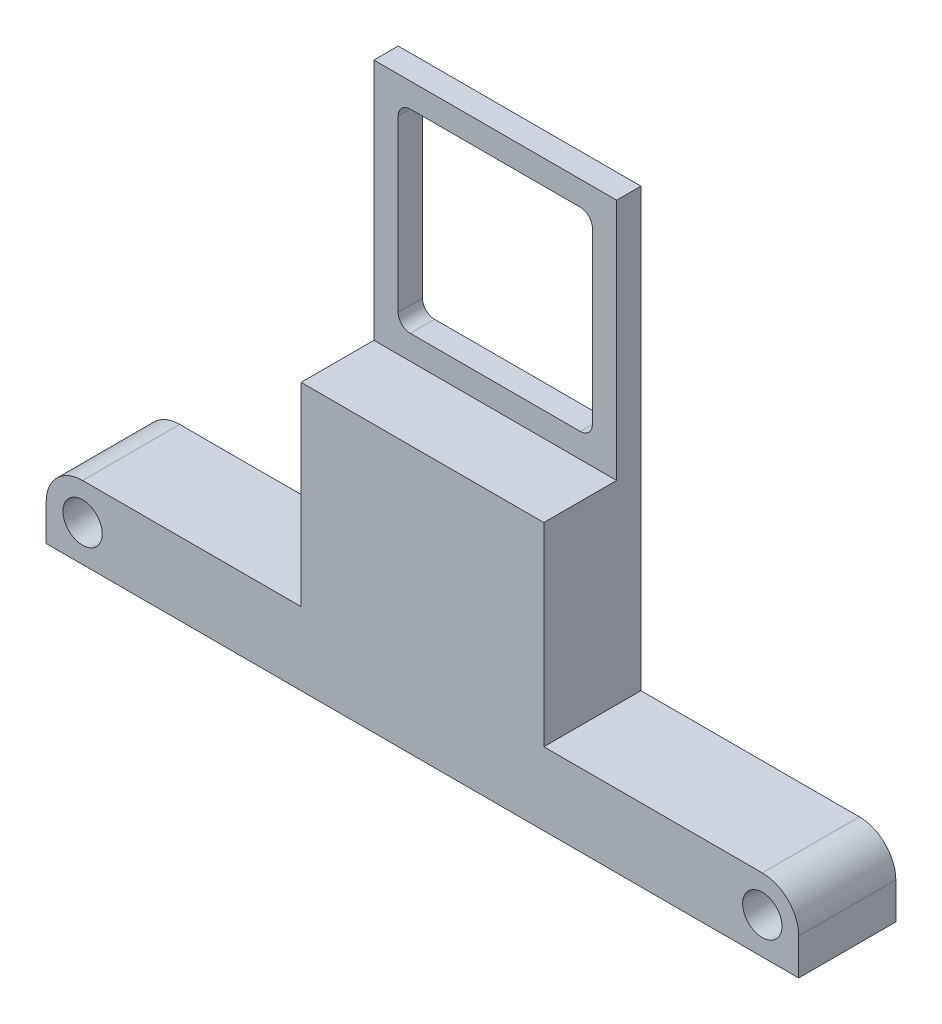
ISO-10303-21;
HEADER;
FILE_DESCRIPTION(('STEP AP214'),'2;1');
FILE_NAME('part.step','',(''),(''),'','','');
FILE_SCHEMA(('AUTOMOTIVE_DESIGN { 1 0 10303 214 1 1 1 1 }'));
ENDSEC;
DATA;
#1=APPLICATION_CONTEXT('core data for automotive mechanical design processes');
#2=APPLICATION_PROTOCOL_DEFINITION('international standard','automotive_design',2000,#1);
#3=PRODUCT_CONTEXT('',#1,'mechanical');
#4=PRODUCT('Part','Part','',(#3));
#5=PRODUCT_RELATED_PRODUCT_CATEGORY('part','',(#4));
#6=PRODUCT_DEFINITION_FORMATION('','',#4);
#7=PRODUCT_DEFINITION_CONTEXT('part definition',#1,'design');
#8=PRODUCT_DEFINITION('design','',#6,#7);
#9=PRODUCT_DEFINITION_SHAPE('','',#8);
#10=(LENGTH_UNIT() NAMED_UNIT(*) SI_UNIT(.MILLI.,.METRE.));
#11=(NAMED_UNIT(*) PLANE_ANGLE_UNIT() SI_UNIT($,.RADIAN.));
#12=(NAMED_UNIT(*) SI_UNIT($,.STERADIAN.) SOLID_ANGLE_UNIT());
#13=UNCERTAINTY_MEASURE_WITH_UNIT(LENGTH_MEASURE(1.E-05),#10,'distance_accuracy_value','');
#14=(GEOMETRIC_REPRESENTATION_CONTEXT(3) GLOBAL_UNCERTAINTY_ASSIGNED_CONTEXT((#13)) GLOBAL_UNIT_ASSIGNED_CONTEXT((#10,
#11,#12)) REPRESENTATION_CONTEXT('',''));
#15=CARTESIAN_POINT('',(0.,0.,0.));
#16=DIRECTION('',(0.,0.,1.));
#17=DIRECTION('',(1.,0.,0.));
#18=AXIS2_PLACEMENT_3D('',#15,#16,#17);
#19=CARTESIAN_POINT('',(-25.,105.,10.));
#20=DIRECTION('',(0.,-1.,0.));
#21=DIRECTION('',(0.,0.,-1.));
#22=AXIS2_PLACEMENT_3D('',#19,#20,#21);
#23=PLANE('',#22);
#24=DIRECTION('',(-1.,0.,0.));
#25=VECTOR('',#24,1.);
#26=CARTESIAN_POINT('',(-25.,105.,-5.));
#27=LINE('',#26,#25);
#28=CARTESIAN_POINT('',(25.,105.,-5.));
#29=VERTEX_POINT('',#28);
#30=CARTESIAN_POINT('',(-25.,105.,-5.));
#31=VERTEX_POINT('',#30);
#32=EDGE_CURVE('E194',#29,#31,#27,.T.);
#33=ORIENTED_EDGE('',*,*,#32,.F.);
#34=DIRECTION('',(0.,0.,-1.));
#35=VECTOR('',#34,1.);
#36=CARTESIAN_POINT('',(25.,105.,10.));
#37=LINE('',#36,#35);
#38=CARTESIAN_POINT('',(25.,105.,-10.));
#39=VERTEX_POINT('',#38);
#40=EDGE_CURVE('E304',#29,#39,#37,.T.);
#41=ORIENTED_EDGE('',*,*,#40,.T.);
#42=DIRECTION('',(-1.,0.,0.));
#43=VECTOR('',#42,1.);
#44=CARTESIAN_POINT('',(-25.,105.,-10.));
#45=LINE('',#44,#43);
#46=CARTESIAN_POINT('',(-25.,105.,-10.));
#47=VERTEX_POINT('',#46);
#48=EDGE_CURVE('E278',#39,#47,#45,.T.);
#49=ORIENTED_EDGE('',*,*,#48,.T.);
#50=DIRECTION('',(0.,0.,-1.));
#51=VECTOR('',#50,1.);
#52=CARTESIAN_POINT('',(-25.,105.,10.));
#53=LINE('',#52,#51);
#54=EDGE_CURVE('E301',#31,#47,#53,.T.);
#55=ORIENTED_EDGE('',*,*,#54,.F.);
#56=EDGE_LOOP('',(#33,#41,#49,#55));
#57=FACE_BOUND('',#56,.T.);
#58=ADVANCED_FACE('F39',(#57),#23,.F.);
#59=CARTESIAN_POINT('',(-70.,7.5,10.));
#60=DIRECTION('',(0.,0.,-1.));
#61=DIRECTION('',(-1.,0.,0.));
#62=AXIS2_PLACEMENT_3D('',#59,#60,#61);
#63=PLANE('',#62);
#64=DIRECTION('',(0.,1.,0.));
#65=VECTOR('',#64,1.);
#66=CARTESIAN_POINT('',(25.,105.,10.));
#67=LINE('',#66,#65);
#68=CARTESIAN_POINT('',(25.,15.,10.));
#69=VERTEX_POINT('',#68);
#70=CARTESIAN_POINT('',(25.,55.,10.));
#71=VERTEX_POINT('',#70);
#72=EDGE_CURVE('E246',#69,#71,#67,.T.);
#73=ORIENTED_EDGE('',*,*,#72,.T.);
#74=DIRECTION('',(1.,0.,0.));
#75=VECTOR('',#74,1.);
#76=CARTESIAN_POINT('',(-25.,55.,10.));
#77=LINE('',#76,#75);
#78=CARTESIAN_POINT('',(-25.,55.,10.));
#79=VERTEX_POINT('',#78);
#80=EDGE_CURVE('E198',#79,#71,#77,.T.);
#81=ORIENTED_EDGE('',*,*,#80,.F.);
#82=DIRECTION('',(0.,-1.,0.));
#83=VECTOR('',#82,1.);
#84=CARTESIAN_POINT('',(-25.,15.,10.));
#85=LINE('',#84,#83);
#86=CARTESIAN_POINT('',(-25.,15.,10.));
#87=VERTEX_POINT('',#86);
#88=EDGE_CURVE('E203',#79,#87,#85,.T.);
#89=ORIENTED_EDGE('',*,*,#88,.T.);
#90=DIRECTION('',(-1.,0.,0.));
#91=VECTOR('',#90,1.);
#92=CARTESIAN_POINT('',(-70.,15.,10.));
#93=LINE('',#92,#91);
#94=CARTESIAN_POINT('',(-70.,15.,10.));
#95=VERTEX_POINT('',#94);
#96=EDGE_CURVE('E252',#87,#95,#93,.T.);
#97=ORIENTED_EDGE('',*,*,#96,.T.);
#98=CARTESIAN_POINT('',(-70.,7.5,10.));
#99=DIRECTION('',(0.,0.,1.));
#100=DIRECTION('',(-1.,0.,0.));
#101=AXIS2_PLACEMENT_3D('',#98,#99,#100);
#102=CIRCLE('',#101,7.5);
#103=CARTESIAN_POINT('',(-77.5,7.5,10.));
#104=VERTEX_POINT('',#103);
#105=EDGE_CURVE('E255',#95,#104,#102,.T.);
#106=ORIENTED_EDGE('',*,*,#105,.T.);
#107=DIRECTION('',(0.,-1.,0.));
#108=VECTOR('',#107,1.);
#109=CARTESIAN_POINT('',(-77.5,0.,10.));
#110=LINE('',#109,#108);
#111=CARTESIAN_POINT('',(-77.5,0.,10.));
#112=VERTEX_POINT('',#111);
#113=EDGE_CURVE('E229',#104,#112,#110,.T.);
#114=ORIENTED_EDGE('',*,*,#113,.T.);
#115=DIRECTION('',(1.,0.,0.));
#116=VECTOR('',#115,1.);
#117=CARTESIAN_POINT('',(-77.5,0.,10.));
#118=LINE('',#117,#116);
#119=CARTESIAN_POINT('',(77.5,0.,10.));
#120=VERTEX_POINT('',#119);
#121=EDGE_CURVE('E233',#112,#120,#118,.T.);
#122=ORIENTED_EDGE('',*,*,#121,.T.);
#123=DIRECTION('',(0.,1.,0.));
#124=VECTOR('',#123,1.);
#125=CARTESIAN_POINT('',(77.5,7.50000000000003,10.));
#126=LINE('',#125,#124);
#127=CARTESIAN_POINT('',(77.5,7.50000000000003,10.));
#128=VERTEX_POINT('',#127);
#129=EDGE_CURVE('E237',#120,#128,#126,.T.);
#130=ORIENTED_EDGE('',*,*,#129,.T.);
#131=CARTESIAN_POINT('',(70.,7.5,10.));
#132=DIRECTION('',(0.,0.,1.));
#133=DIRECTION('',(-1.,0.,0.));
#134=AXIS2_PLACEMENT_3D('',#131,#132,#133);
#135=CIRCLE('',#134,7.50000000000001);
#136=CARTESIAN_POINT('',(70.,15.,10.));
#137=VERTEX_POINT('',#136);
#138=EDGE_CURVE('E240',#128,#137,#135,.T.);
#139=ORIENTED_EDGE('',*,*,#138,.T.);
#140=DIRECTION('',(-1.,0.,0.));
#141=VECTOR('',#140,1.);
#142=CARTESIAN_POINT('',(25.,15.,10.));
#143=LINE('',#142,#141);
#144=EDGE_CURVE('E243',#137,#69,#143,.T.);
#145=ORIENTED_EDGE('',*,*,#144,.T.);
#146=EDGE_LOOP('',(#73,#81,#89,#97,#106,#114,#122,#130,#139,#145));
#147=FACE_BOUND('',#146,.T.);
#148=CARTESIAN_POINT('',(-70.,7.5,10.));
#149=DIRECTION('',(0.,0.,1.));
#150=DIRECTION('',(1.,0.,0.));
#151=AXIS2_PLACEMENT_3D('',#148,#149,#150);
#152=CIRCLE('',#151,4.05);
#153=CARTESIAN_POINT('',(-65.95,7.5,10.));
#154=VERTEX_POINT('',#153);
#155=EDGE_CURVE('E221',#154,#154,#152,.T.);
#156=ORIENTED_EDGE('',*,*,#155,.F.);
#157=EDGE_LOOP('',(#156));
#158=FACE_BOUND('',#157,.T.);
#159=CARTESIAN_POINT('',(70.,7.5,10.));
#160=DIRECTION('',(0.,0.,1.));
#161=DIRECTION('',(1.,0.,0.));
#162=AXIS2_PLACEMENT_3D('',#159,#160,#161);
#163=CIRCLE('',#162,4.05);
#164=CARTESIAN_POINT('',(74.05,7.5,10.));
#165=VERTEX_POINT('',#164);
#166=EDGE_CURVE('E213',#165,#165,#163,.T.);
#167=ORIENTED_EDGE('',*,*,#166,.F.);
#168=EDGE_LOOP('',(#167));
#169=FACE_BOUND('',#168,.T.);
#170=ADVANCED_FACE('F423',(#147,#158,#169),#63,.F.);
#171=CARTESIAN_POINT('',(-70.,7.5,-10.));
#172=DIRECTION('',(0.,0.,-1.));
#173=DIRECTION('',(-1.,0.,0.));
#174=AXIS2_PLACEMENT_3D('',#171,#172,#173);
#175=PLANE('',#174);
#176=DIRECTION('',(-1.,0.,0.));
#177=VECTOR('',#176,1.);
#178=CARTESIAN_POINT('',(-20.,100.,-10.));
#179=LINE('',#178,#177);
#180=CARTESIAN_POINT('',(17.5,100.,-10.));
#181=VERTEX_POINT('',#180);
#182=CARTESIAN_POINT('',(-17.5,100.,-10.));
#183=VERTEX_POINT('',#182);
#184=EDGE_CURVE('E400',#181,#183,#179,.T.);
#185=ORIENTED_EDGE('',*,*,#184,.T.);
#186=CARTESIAN_POINT('',(-17.5,97.5,-10.));
#187=DIRECTION('',(0.,0.,-1.));
#188=DIRECTION('',(-1.,0.,0.));
#189=AXIS2_PLACEMENT_3D('',#186,#187,#188);
#190=CIRCLE('',#189,2.5);
#191=CARTESIAN_POINT('',(-20.,97.5,-10.));
#192=VERTEX_POINT('',#191);
#193=EDGE_CURVE('E62',#183,#192,#190,.F.);
#194=ORIENTED_EDGE('',*,*,#193,.T.);
#195=DIRECTION('',(0.,-1.,0.));
#196=VECTOR('',#195,1.);
#197=CARTESIAN_POINT('',(-20.,100.,-10.));
#198=LINE('',#197,#196);
#199=CARTESIAN_POINT('',(-20.,62.5,-10.));
#200=VERTEX_POINT('',#199);
#201=EDGE_CURVE('E390',#192,#200,#198,.T.);
#202=ORIENTED_EDGE('',*,*,#201,.T.);
#203=CARTESIAN_POINT('',(-17.5,62.5,-10.));
#204=DIRECTION('',(0.,0.,-1.));
#205=DIRECTION('',(-1.,0.,0.));
#206=AXIS2_PLACEMENT_3D('',#203,#204,#205);
#207=CIRCLE('',#206,2.5);
#208=CARTESIAN_POINT('',(-17.5,60.,-10.));
#209=VERTEX_POINT('',#208);
#210=EDGE_CURVE('E11',#200,#209,#207,.F.);
#211=ORIENTED_EDGE('',*,*,#210,.T.);
#212=DIRECTION('',(1.,0.,0.));
#213=VECTOR('',#212,1.);
#214=CARTESIAN_POINT('',(-20.,60.,-10.));
#215=LINE('',#214,#213);
#216=CARTESIAN_POINT('',(17.5,60.,-10.));
#217=VERTEX_POINT('',#216);
#218=EDGE_CURVE('E388',#209,#217,#215,.T.);
#219=ORIENTED_EDGE('',*,*,#218,.T.);
#220=CARTESIAN_POINT('',(17.5,62.5,-10.));
#221=DIRECTION('',(0.,0.,-1.));
#222=DIRECTION('',(-1.,0.,0.));
#223=AXIS2_PLACEMENT_3D('',#220,#221,#222);
#224=CIRCLE('',#223,2.5);
#225=CARTESIAN_POINT('',(20.,62.5,-10.));
#226=VERTEX_POINT('',#225);
#227=EDGE_CURVE('E363',#217,#226,#224,.F.);
#228=ORIENTED_EDGE('',*,*,#227,.T.);
#229=DIRECTION('',(0.,1.,0.));
#230=VECTOR('',#229,1.);
#231=CARTESIAN_POINT('',(20.,100.,-10.));
#232=LINE('',#231,#230);
#233=CARTESIAN_POINT('',(20.,97.5,-10.));
#234=VERTEX_POINT('',#233);
#235=EDGE_CURVE('E395',#226,#234,#232,.T.);
#236=ORIENTED_EDGE('',*,*,#235,.T.);
#237=CARTESIAN_POINT('',(17.5,97.5,-10.));
#238=DIRECTION('',(0.,0.,-1.));
#239=DIRECTION('',(-1.,0.,0.));
#240=AXIS2_PLACEMENT_3D('',#237,#238,#239);
#241=CIRCLE('',#240,2.5);
#242=EDGE_CURVE('E357',#234,#181,#241,.F.);
#243=ORIENTED_EDGE('',*,*,#242,.T.);
#244=EDGE_LOOP('',(#185,#194,#202,#211,#219,#228,#236,#243));
#245=FACE_BOUND('',#244,.T.);
#246=CARTESIAN_POINT('',(-70.,7.5,-10.));
#247=DIRECTION('',(0.,0.,1.));
#248=DIRECTION('',(1.,0.,0.));
#249=AXIS2_PLACEMENT_3D('',#246,#247,#248);
#250=CIRCLE('',#249,4.05);
#251=CARTESIAN_POINT('',(-65.95,7.5,-10.));
#252=VERTEX_POINT('',#251);
#253=EDGE_CURVE('E217',#252,#252,#250,.T.);
#254=ORIENTED_EDGE('',*,*,#253,.T.);
#255=EDGE_LOOP('',(#254));
#256=FACE_BOUND('',#255,.T.);
#257=DIRECTION('',(0.,-1.,0.));
#258=VECTOR('',#257,1.);
#259=CARTESIAN_POINT('',(-77.5,0.,-10.));
#260=LINE('',#259,#258);
#261=CARTESIAN_POINT('',(-77.5,7.5,-10.));
#262=VERTEX_POINT('',#261);
#263=CARTESIAN_POINT('',(-77.5,0.,-10.));
#264=VERTEX_POINT('',#263);
#265=EDGE_CURVE('E225',#262,#264,#260,.T.);
#266=ORIENTED_EDGE('',*,*,#265,.F.);
#267=CARTESIAN_POINT('',(-70.,7.5,-10.));
#268=DIRECTION('',(0.,0.,1.));
#269=DIRECTION('',(-1.,0.,0.));
#270=AXIS2_PLACEMENT_3D('',#267,#268,#269);
#271=CIRCLE('',#270,7.5);
#272=CARTESIAN_POINT('',(-70.,15.,-10.));
#273=VERTEX_POINT('',#272);
#274=EDGE_CURVE('E234',#273,#262,#271,.T.);
#275=ORIENTED_EDGE('',*,*,#274,.F.);
#276=DIRECTION('',(-1.,0.,0.));
#277=VECTOR('',#276,1.);
#278=CARTESIAN_POINT('',(-70.,15.,-10.));
#279=LINE('',#278,#277);
#280=CARTESIAN_POINT('',(-25.,15.,-10.));
#281=VERTEX_POINT('',#280);
#282=EDGE_CURVE('E285',#281,#273,#279,.T.);
#283=ORIENTED_EDGE('',*,*,#282,.F.);
#284=DIRECTION('',(0.,-1.,0.));
#285=VECTOR('',#284,1.);
#286=CARTESIAN_POINT('',(-25.,15.,-10.));
#287=LINE('',#286,#285);
#288=EDGE_CURVE('E282',#47,#281,#287,.T.);
#289=ORIENTED_EDGE('',*,*,#288,.F.);
#290=ORIENTED_EDGE('',*,*,#48,.F.);
#291=DIRECTION('',(0.,1.,0.));
#292=VECTOR('',#291,1.);
#293=CARTESIAN_POINT('',(25.,105.,-10.));
#294=LINE('',#293,#292);
#295=CARTESIAN_POINT('',(25.,15.,-10.));
#296=VERTEX_POINT('',#295);
#297=EDGE_CURVE('E274',#296,#39,#294,.T.);
#298=ORIENTED_EDGE('',*,*,#297,.F.);
#299=DIRECTION('',(-1.,0.,0.));
#300=VECTOR('',#299,1.);
#301=CARTESIAN_POINT('',(25.,15.,-10.));
#302=LINE('',#301,#300);
#303=CARTESIAN_POINT('',(70.,15.,-10.));
#304=VERTEX_POINT('',#303);
#305=EDGE_CURVE('E271',#304,#296,#302,.T.);
#306=ORIENTED_EDGE('',*,*,#305,.F.);
#307=CARTESIAN_POINT('',(70.,7.5,-10.));
#308=DIRECTION('',(0.,0.,1.));
#309=DIRECTION('',(-1.,0.,0.));
#310=AXIS2_PLACEMENT_3D('',#307,#308,#309);
#311=CIRCLE('',#310,7.50000000000001);
#312=CARTESIAN_POINT('',(77.5,7.50000000000003,-10.));
#313=VERTEX_POINT('',#312);
#314=EDGE_CURVE('E268',#313,#304,#311,.T.);
#315=ORIENTED_EDGE('',*,*,#314,.F.);
#316=DIRECTION('',(0.,1.,0.));
#317=VECTOR('',#316,1.);
#318=CARTESIAN_POINT('',(77.5,7.50000000000003,-10.));
#319=LINE('',#318,#317);
#320=CARTESIAN_POINT('',(77.5,0.,-10.));
#321=VERTEX_POINT('',#320);
#322=EDGE_CURVE('E265',#321,#313,#319,.T.);
#323=ORIENTED_EDGE('',*,*,#322,.F.);
#324=DIRECTION('',(1.,0.,0.));
#325=VECTOR('',#324,1.);
#326=CARTESIAN_POINT('',(-77.5,0.,-10.));
#327=LINE('',#326,#325);
#328=EDGE_CURVE('E262',#264,#321,#327,.T.);
#329=ORIENTED_EDGE('',*,*,#328,.F.);
#330=EDGE_LOOP('',(#266,#275,#283,#289,#290,#298,#306,#315,#323,#329));
#331=FACE_BOUND('',#330,.T.);
#332=CARTESIAN_POINT('',(70.,7.5,-10.));
#333=DIRECTION('',(0.,0.,1.));
#334=DIRECTION('',(1.,0.,0.));
#335=AXIS2_PLACEMENT_3D('',#332,#333,#334);
#336=CIRCLE('',#335,4.05);
#337=CARTESIAN_POINT('',(74.05,7.5,-10.));
#338=VERTEX_POINT('',#337);
#339=EDGE_CURVE('E208',#338,#338,#336,.T.);
#340=ORIENTED_EDGE('',*,*,#339,.T.);
#341=EDGE_LOOP('',(#340));
#342=FACE_BOUND('',#341,.T.);
#343=ADVANCED_FACE('F386',(#245,#256,#331,#342),#175,.T.);
#344=CARTESIAN_POINT('',(-77.5,0.,10.));
#345=DIRECTION('',(1.,0.,0.));
#346=DIRECTION('',(0.,1.,0.));
#347=AXIS2_PLACEMENT_3D('',#344,#345,#346);
#348=PLANE('',#347);
#349=ORIENTED_EDGE('',*,*,#265,.T.);
#350=DIRECTION('',(0.,0.,-1.));
#351=VECTOR('',#350,1.);
#352=CARTESIAN_POINT('',(-77.5,0.,10.));
#353=LINE('',#352,#351);
#354=EDGE_CURVE('E323',#112,#264,#353,.T.);
#355=ORIENTED_EDGE('',*,*,#354,.F.);
#356=ORIENTED_EDGE('',*,*,#113,.F.);
#357=DIRECTION('',(0.,0.,-1.));
#358=VECTOR('',#357,1.);
#359=CARTESIAN_POINT('',(-77.5,7.5,10.));
#360=LINE('',#359,#358);
#361=EDGE_CURVE('E258',#104,#262,#360,.T.);
#362=ORIENTED_EDGE('',*,*,#361,.T.);
#363=EDGE_LOOP('',(#349,#355,#356,#362));
#364=FACE_BOUND('',#363,.T.);
#365=ADVANCED_FACE('F452',(#364),#348,.F.);
#366=CARTESIAN_POINT('',(-77.5,0.,10.));
#367=DIRECTION('',(0.,1.,0.));
#368=DIRECTION('',(-1.,0.,0.));
#369=AXIS2_PLACEMENT_3D('',#366,#367,#368);
#370=PLANE('',#369);
#371=ORIENTED_EDGE('',*,*,#328,.T.);
#372=DIRECTION('',(0.,0.,-1.));
#373=VECTOR('',#372,1.);
#374=CARTESIAN_POINT('',(77.5,0.,10.));
#375=LINE('',#374,#373);
#376=EDGE_CURVE('E319',#120,#321,#375,.T.);
#377=ORIENTED_EDGE('',*,*,#376,.F.);
#378=ORIENTED_EDGE('',*,*,#121,.F.);
#379=ORIENTED_EDGE('',*,*,#354,.T.);
#380=EDGE_LOOP('',(#371,#377,#378,#379));
#381=FACE_BOUND('',#380,.T.);
#382=ADVANCED_FACE('F458',(#381),#370,.F.);
#383=CARTESIAN_POINT('',(77.5,7.50000000000003,10.));
#384=DIRECTION('',(-1.,0.,0.));
#385=DIRECTION('',(0.,-1.,0.));
#386=AXIS2_PLACEMENT_3D('',#383,#384,#385);
#387=PLANE('',#386);
#388=ORIENTED_EDGE('',*,*,#322,.T.);
#389=DIRECTION('',(0.,0.,-1.));
#390=VECTOR('',#389,1.);
#391=CARTESIAN_POINT('',(77.5,7.50000000000003,10.));
#392=LINE('',#391,#390);
#393=EDGE_CURVE('E315',#128,#313,#392,.T.);
#394=ORIENTED_EDGE('',*,*,#393,.F.);
#395=ORIENTED_EDGE('',*,*,#129,.F.);
#396=ORIENTED_EDGE('',*,*,#376,.T.);
#397=EDGE_LOOP('',(#388,#394,#395,#396));
#398=FACE_BOUND('',#397,.T.);
#399=ADVANCED_FACE('F461',(#398),#387,.F.);
#400=CARTESIAN_POINT('',(70.,7.5,10.));
#401=DIRECTION('',(0.,0.,-1.));
#402=DIRECTION('',(-1.,0.,0.));
#403=AXIS2_PLACEMENT_3D('',#400,#401,#402);
#404=CYLINDRICAL_SURFACE('',#403,7.50000000000001);
#405=ORIENTED_EDGE('',*,*,#314,.T.);
#406=DIRECTION('',(0.,0.,-1.));
#407=VECTOR('',#406,1.);
#408=CARTESIAN_POINT('',(70.,15.,10.));
#409=LINE('',#408,#407);
#410=EDGE_CURVE('E311',#137,#304,#409,.T.);
#411=ORIENTED_EDGE('',*,*,#410,.F.);
#412=ORIENTED_EDGE('',*,*,#138,.F.);
#413=ORIENTED_EDGE('',*,*,#393,.T.);
#414=EDGE_LOOP('',(#405,#411,#412,#413));
#415=FACE_BOUND('',#414,.T.);
#416=ADVANCED_FACE('F463',(#415),#404,.T.);
#417=CARTESIAN_POINT('',(25.,15.,10.));
#418=DIRECTION('',(0.,-1.,0.));
#419=DIRECTION('',(1.,0.,0.));
#420=AXIS2_PLACEMENT_3D('',#417,#418,#419);
#421=PLANE('',#420);
#422=ORIENTED_EDGE('',*,*,#305,.T.);
#423=DIRECTION('',(0.,0.,-1.));
#424=VECTOR('',#423,1.);
#425=CARTESIAN_POINT('',(25.,15.,10.));
#426=LINE('',#425,#424);
#427=EDGE_CURVE('E307',#69,#296,#426,.T.);
#428=ORIENTED_EDGE('',*,*,#427,.F.);
#429=ORIENTED_EDGE('',*,*,#144,.F.);
#430=ORIENTED_EDGE('',*,*,#410,.T.);
#431=EDGE_LOOP('',(#422,#428,#429,#430));
#432=FACE_BOUND('',#431,.T.);
#433=ADVANCED_FACE('F430',(#432),#421,.F.);
#434=CARTESIAN_POINT('',(25.,105.,10.));
#435=DIRECTION('',(-1.,0.,0.));
#436=DIRECTION('',(0.,0.,1.));
#437=AXIS2_PLACEMENT_3D('',#434,#435,#436);
#438=PLANE('',#437);
#439=DIRECTION('',(0.,1.,0.));
#440=VECTOR('',#439,1.);
#441=CARTESIAN_POINT('',(25.,105.,-5.));
#442=LINE('',#441,#440);
#443=CARTESIAN_POINT('',(25.,55.,-5.));
#444=VERTEX_POINT('',#443);
#445=EDGE_CURVE('E188',#444,#29,#442,.T.);
#446=ORIENTED_EDGE('',*,*,#445,.F.);
#447=DIRECTION('',(0.,0.,1.));
#448=VECTOR('',#447,1.);
#449=CARTESIAN_POINT('',(25.,55.,-5.));
#450=LINE('',#449,#448);
#451=EDGE_CURVE('E184',#444,#71,#450,.T.);
#452=ORIENTED_EDGE('',*,*,#451,.T.);
#453=ORIENTED_EDGE('',*,*,#72,.F.);
#454=ORIENTED_EDGE('',*,*,#427,.T.);
#455=ORIENTED_EDGE('',*,*,#297,.T.);
#456=ORIENTED_EDGE('',*,*,#40,.F.);
#457=EDGE_LOOP('',(#446,#452,#453,#454,#455,#456));
#458=FACE_BOUND('',#457,.T.);
#459=ADVANCED_FACE('F421',(#458),#438,.F.);
#460=CARTESIAN_POINT('',(-25.,15.,10.));
#461=DIRECTION('',(1.,0.,0.));
#462=DIRECTION('',(0.,0.,-1.));
#463=AXIS2_PLACEMENT_3D('',#460,#461,#462);
#464=PLANE('',#463);
#465=ORIENTED_EDGE('',*,*,#88,.F.);
#466=DIRECTION('',(0.,0.,1.));
#467=VECTOR('',#466,1.);
#468=CARTESIAN_POINT('',(-25.,55.,-5.));
#469=LINE('',#468,#467);
#470=CARTESIAN_POINT('',(-25.,55.,-5.));
#471=VERTEX_POINT('',#470);
#472=EDGE_CURVE('E181',#471,#79,#469,.T.);
#473=ORIENTED_EDGE('',*,*,#472,.F.);
#474=DIRECTION('',(0.,-1.,0.));
#475=VECTOR('',#474,1.);
#476=CARTESIAN_POINT('',(-25.,105.,-5.));
#477=LINE('',#476,#475);
#478=EDGE_CURVE('E189',#31,#471,#477,.T.);
#479=ORIENTED_EDGE('',*,*,#478,.F.);
#480=ORIENTED_EDGE('',*,*,#54,.T.);
#481=ORIENTED_EDGE('',*,*,#288,.T.);
#482=DIRECTION('',(0.,0.,-1.));
#483=VECTOR('',#482,1.);
#484=CARTESIAN_POINT('',(-25.,15.,10.));
#485=LINE('',#484,#483);
#486=EDGE_CURVE('E297',#87,#281,#485,.T.);
#487=ORIENTED_EDGE('',*,*,#486,.F.);
#488=EDGE_LOOP('',(#465,#473,#479,#480,#481,#487));
#489=FACE_BOUND('',#488,.T.);
#490=ADVANCED_FACE('F201',(#489),#464,.F.);
#491=CARTESIAN_POINT('',(-70.,15.,10.));
#492=DIRECTION('',(0.,-1.,0.));
#493=DIRECTION('',(1.,0.,0.));
#494=AXIS2_PLACEMENT_3D('',#491,#492,#493);
#495=PLANE('',#494);
#496=ORIENTED_EDGE('',*,*,#282,.T.);
#497=DIRECTION('',(0.,0.,-1.));
#498=VECTOR('',#497,1.);
#499=CARTESIAN_POINT('',(-70.,15.,10.));
#500=LINE('',#499,#498);
#501=EDGE_CURVE('E293',#95,#273,#500,.T.);
#502=ORIENTED_EDGE('',*,*,#501,.F.);
#503=ORIENTED_EDGE('',*,*,#96,.F.);
#504=ORIENTED_EDGE('',*,*,#486,.T.);
#505=EDGE_LOOP('',(#496,#502,#503,#504));
#506=FACE_BOUND('',#505,.T.);
#507=ADVANCED_FACE('F443',(#506),#495,.F.);
#508=CARTESIAN_POINT('',(-70.,7.5,10.));
#509=DIRECTION('',(0.,0.,-1.));
#510=DIRECTION('',(-1.,0.,0.));
#511=AXIS2_PLACEMENT_3D('',#508,#509,#510);
#512=CYLINDRICAL_SURFACE('',#511,7.5);
#513=ORIENTED_EDGE('',*,*,#274,.T.);
#514=ORIENTED_EDGE('',*,*,#361,.F.);
#515=ORIENTED_EDGE('',*,*,#105,.F.);
#516=ORIENTED_EDGE('',*,*,#501,.T.);
#517=EDGE_LOOP('',(#513,#514,#515,#516));
#518=FACE_BOUND('',#517,.T.);
#519=ADVANCED_FACE('F448',(#518),#512,.T.);
#520=CARTESIAN_POINT('',(-70.,7.5,10.));
#521=DIRECTION('',(0.,0.,-1.));
#522=DIRECTION('',(-1.,0.,0.));
#523=AXIS2_PLACEMENT_3D('',#520,#521,#522);
#524=CYLINDRICAL_SURFACE('',#523,4.05);
#525=ORIENTED_EDGE('',*,*,#155,.T.);
#526=EDGE_LOOP('',(#525));
#527=FACE_BOUND('',#526,.T.);
#528=ORIENTED_EDGE('',*,*,#253,.F.);
#529=EDGE_LOOP('',(#528));
#530=FACE_BOUND('',#529,.T.);
#531=ADVANCED_FACE('F491',(#527,#530),#524,.F.);
#532=CARTESIAN_POINT('',(70.,7.5,10.));
#533=DIRECTION('',(0.,0.,-1.));
#534=DIRECTION('',(-1.,0.,0.));
#535=AXIS2_PLACEMENT_3D('',#532,#533,#534);
#536=CYLINDRICAL_SURFACE('',#535,4.05);
#537=ORIENTED_EDGE('',*,*,#166,.T.);
#538=EDGE_LOOP('',(#537));
#539=FACE_BOUND('',#538,.T.);
#540=ORIENTED_EDGE('',*,*,#339,.F.);
#541=EDGE_LOOP('',(#540));
#542=FACE_BOUND('',#541,.T.);
#543=ADVANCED_FACE('F498',(#539,#542),#536,.F.);
#544=CARTESIAN_POINT('',(-25.,55.,-5.));
#545=DIRECTION('',(0.,-1.,0.));
#546=DIRECTION('',(0.,0.,-1.));
#547=AXIS2_PLACEMENT_3D('',#544,#545,#546);
#548=PLANE('',#547);
#549=ORIENTED_EDGE('',*,*,#80,.T.);
#550=ORIENTED_EDGE('',*,*,#451,.F.);
#551=DIRECTION('',(1.,0.,0.));
#552=VECTOR('',#551,1.);
#553=CARTESIAN_POINT('',(-25.,55.,-5.));
#554=LINE('',#553,#552);
#555=EDGE_CURVE('E177',#471,#444,#554,.T.);
#556=ORIENTED_EDGE('',*,*,#555,.F.);
#557=ORIENTED_EDGE('',*,*,#472,.T.);
#558=EDGE_LOOP('',(#549,#550,#556,#557));
#559=FACE_BOUND('',#558,.T.);
#560=ADVANCED_FACE('F179',(#559),#548,.F.);
#561=CARTESIAN_POINT('',(0.,0.,-5.));
#562=DIRECTION('',(0.,0.,1.));
#563=DIRECTION('',(1.,0.,0.));
#564=AXIS2_PLACEMENT_3D('',#561,#562,#563);
#565=PLANE('',#564);
#566=DIRECTION('',(0.,-1.,0.));
#567=VECTOR('',#566,1.);
#568=CARTESIAN_POINT('',(-20.,100.,-5.));
#569=LINE('',#568,#567);
#570=CARTESIAN_POINT('',(-20.,97.5,-5.));
#571=VERTEX_POINT('',#570);
#572=CARTESIAN_POINT('',(-20.,62.5,-5.));
#573=VERTEX_POINT('',#572);
#574=EDGE_CURVE('E374',#571,#573,#569,.T.);
#575=ORIENTED_EDGE('',*,*,#574,.F.);
#576=CARTESIAN_POINT('',(-17.5,97.5,-5.));
#577=DIRECTION('',(0.,0.,1.));
#578=DIRECTION('',(1.,0.,0.));
#579=AXIS2_PLACEMENT_3D('',#576,#577,#578);
#580=CIRCLE('',#579,2.5);
#581=CARTESIAN_POINT('',(-17.5,100.,-5.));
#582=VERTEX_POINT('',#581);
#583=EDGE_CURVE('E366',#571,#582,#580,.F.);
#584=ORIENTED_EDGE('',*,*,#583,.T.);
#585=DIRECTION('',(-1.,0.,0.));
#586=VECTOR('',#585,1.);
#587=CARTESIAN_POINT('',(-20.,100.,-5.));
#588=LINE('',#587,#586);
#589=CARTESIAN_POINT('',(17.5,100.,-5.));
#590=VERTEX_POINT('',#589);
#591=EDGE_CURVE('E402',#590,#582,#588,.T.);
#592=ORIENTED_EDGE('',*,*,#591,.F.);
#593=CARTESIAN_POINT('',(17.5,97.5,-5.));
#594=DIRECTION('',(0.,0.,1.));
#595=DIRECTION('',(1.,0.,0.));
#596=AXIS2_PLACEMENT_3D('',#593,#594,#595);
#597=CIRCLE('',#596,2.5);
#598=CARTESIAN_POINT('',(20.,97.5,-5.));
#599=VERTEX_POINT('',#598);
#600=EDGE_CURVE('E354',#590,#599,#597,.F.);
#601=ORIENTED_EDGE('',*,*,#600,.T.);
#602=DIRECTION('',(0.,1.,0.));
#603=VECTOR('',#602,1.);
#604=CARTESIAN_POINT('',(20.,100.,-5.));
#605=LINE('',#604,#603);
#606=CARTESIAN_POINT('',(20.,62.5,-5.));
#607=VERTEX_POINT('',#606);
#608=EDGE_CURVE('E409',#607,#599,#605,.T.);
#609=ORIENTED_EDGE('',*,*,#608,.F.);
#610=CARTESIAN_POINT('',(17.5,62.5,-5.));
#611=DIRECTION('',(0.,0.,1.));
#612=DIRECTION('',(1.,0.,0.));
#613=AXIS2_PLACEMENT_3D('',#610,#611,#612);
#614=CIRCLE('',#613,2.5);
#615=CARTESIAN_POINT('',(17.5,60.,-5.));
#616=VERTEX_POINT('',#615);
#617=EDGE_CURVE('E360',#607,#616,#614,.F.);
#618=ORIENTED_EDGE('',*,*,#617,.T.);
#619=DIRECTION('',(1.,0.,0.));
#620=VECTOR('',#619,1.);
#621=CARTESIAN_POINT('',(-20.,60.,-5.));
#622=LINE('',#621,#620);
#623=CARTESIAN_POINT('',(-17.5,60.,-5.));
#624=VERTEX_POINT('',#623);
#625=EDGE_CURVE('E376',#624,#616,#622,.T.);
#626=ORIENTED_EDGE('',*,*,#625,.F.);
#627=CARTESIAN_POINT('',(-17.5,62.5,-5.));
#628=DIRECTION('',(0.,0.,1.));
#629=DIRECTION('',(1.,0.,0.));
#630=AXIS2_PLACEMENT_3D('',#627,#628,#629);
#631=CIRCLE('',#630,2.5);
#632=EDGE_CURVE('E48',#624,#573,#631,.F.);
#633=ORIENTED_EDGE('',*,*,#632,.T.);
#634=EDGE_LOOP('',(#575,#584,#592,#601,#609,#618,#626,#633));
#635=FACE_BOUND('',#634,.T.);
#636=ORIENTED_EDGE('',*,*,#478,.T.);
#637=ORIENTED_EDGE('',*,*,#555,.T.);
#638=ORIENTED_EDGE('',*,*,#445,.T.);
#639=ORIENTED_EDGE('',*,*,#32,.T.);
#640=EDGE_LOOP('',(#636,#637,#638,#639));
#641=FACE_BOUND('',#640,.T.);
#642=ADVANCED_FACE('F192',(#635,#641),#565,.T.);
#643=CARTESIAN_POINT('',(-20.,100.,-10.));
#644=DIRECTION('',(-1.,0.,0.));
#645=DIRECTION('',(0.,0.,1.));
#646=AXIS2_PLACEMENT_3D('',#643,#644,#645);
#647=PLANE('',#646);
#648=ORIENTED_EDGE('',*,*,#201,.F.);
#649=DIRECTION('',(0.,0.,1.));
#650=VECTOR('',#649,1.);
#651=CARTESIAN_POINT('',(-20.,97.5,-5.));
#652=LINE('',#651,#650);
#653=EDGE_CURVE('E350',#192,#571,#652,.T.);
#654=ORIENTED_EDGE('',*,*,#653,.T.);
#655=ORIENTED_EDGE('',*,*,#574,.T.);
#656=DIRECTION('',(0.,0.,1.));
#657=VECTOR('',#656,1.);
#658=CARTESIAN_POINT('',(-20.,62.5,-10.));
#659=LINE('',#658,#657);
#660=EDGE_CURVE('E55',#573,#200,#659,.F.);
#661=ORIENTED_EDGE('',*,*,#660,.T.);
#662=EDGE_LOOP('',(#648,#654,#655,#661));
#663=FACE_BOUND('',#662,.T.);
#664=ADVANCED_FACE('F379',(#663),#647,.F.);
#665=CARTESIAN_POINT('',(-20.,100.,-10.));
#666=DIRECTION('',(0.,1.,0.));
#667=DIRECTION('',(0.,0.,1.));
#668=AXIS2_PLACEMENT_3D('',#665,#666,#667);
#669=PLANE('',#668);
#670=ORIENTED_EDGE('',*,*,#184,.F.);
#671=DIRECTION('',(0.,0.,1.));
#672=VECTOR('',#671,1.);
#673=CARTESIAN_POINT('',(17.5,100.,-5.));
#674=LINE('',#673,#672);
#675=EDGE_CURVE('E330',#181,#590,#674,.T.);
#676=ORIENTED_EDGE('',*,*,#675,.T.);
#677=ORIENTED_EDGE('',*,*,#591,.T.);
#678=DIRECTION('',(0.,0.,1.));
#679=VECTOR('',#678,1.);
#680=CARTESIAN_POINT('',(-17.5,100.,-10.));
#681=LINE('',#680,#679);
#682=EDGE_CURVE('E327',#582,#183,#681,.F.);
#683=ORIENTED_EDGE('',*,*,#682,.T.);
#684=EDGE_LOOP('',(#670,#676,#677,#683));
#685=FACE_BOUND('',#684,.T.);
#686=ADVANCED_FACE('F509',(#685),#669,.F.);
#687=CARTESIAN_POINT('',(20.,100.,-10.));
#688=DIRECTION('',(1.,0.,0.));
#689=DIRECTION('',(0.,1.,0.));
#690=AXIS2_PLACEMENT_3D('',#687,#688,#689);
#691=PLANE('',#690);
#692=ORIENTED_EDGE('',*,*,#608,.T.);
#693=DIRECTION('',(0.,0.,1.));
#694=VECTOR('',#693,1.);
#695=CARTESIAN_POINT('',(20.,97.5,-10.));
#696=LINE('',#695,#694);
#697=EDGE_CURVE('E338',#599,#234,#696,.F.);
#698=ORIENTED_EDGE('',*,*,#697,.T.);
#699=ORIENTED_EDGE('',*,*,#235,.F.);
#700=DIRECTION('',(0.,0.,1.));
#701=VECTOR('',#700,1.);
#702=CARTESIAN_POINT('',(20.,62.5,-5.));
#703=LINE('',#702,#701);
#704=EDGE_CURVE('E334',#226,#607,#703,.T.);
#705=ORIENTED_EDGE('',*,*,#704,.T.);
#706=EDGE_LOOP('',(#692,#698,#699,#705));
#707=FACE_BOUND('',#706,.T.);
#708=ADVANCED_FACE('F513',(#707),#691,.F.);
#709=CARTESIAN_POINT('',(-20.,60.,-10.));
#710=DIRECTION('',(0.,-1.,0.));
#711=DIRECTION('',(0.,0.,-1.));
#712=AXIS2_PLACEMENT_3D('',#709,#710,#711);
#713=PLANE('',#712);
#714=ORIENTED_EDGE('',*,*,#625,.T.);
#715=DIRECTION('',(0.,0.,1.));
#716=VECTOR('',#715,1.);
#717=CARTESIAN_POINT('',(17.5,60.,-10.));
#718=LINE('',#717,#716);
#719=EDGE_CURVE('E345',#616,#217,#718,.F.);
#720=ORIENTED_EDGE('',*,*,#719,.T.);
#721=ORIENTED_EDGE('',*,*,#218,.F.);
#722=DIRECTION('',(0.,0.,1.));
#723=VECTOR('',#722,1.);
#724=CARTESIAN_POINT('',(-17.5,60.,-5.));
#725=LINE('',#724,#723);
#726=EDGE_CURVE('E341',#209,#624,#725,.T.);
#727=ORIENTED_EDGE('',*,*,#726,.T.);
#728=EDGE_LOOP('',(#714,#720,#721,#727));
#729=FACE_BOUND('',#728,.T.);
#730=ADVANCED_FACE('F392',(#729),#713,.F.);
#731=CARTESIAN_POINT('',(17.5,97.5,-10.));
#732=DIRECTION('',(0.,0.,-1.));
#733=DIRECTION('',(-1.,0.,0.));
#734=AXIS2_PLACEMENT_3D('',#731,#732,#733);
#735=CYLINDRICAL_SURFACE('',#734,2.5);
#736=ORIENTED_EDGE('',*,*,#242,.F.);
#737=ORIENTED_EDGE('',*,*,#697,.F.);
#738=ORIENTED_EDGE('',*,*,#600,.F.);
#739=ORIENTED_EDGE('',*,*,#675,.F.);
#740=EDGE_LOOP('',(#736,#737,#738,#739));
#741=FACE_BOUND('',#740,.T.);
#742=ADVANCED_FACE('F512',(#741),#735,.F.);
#743=CARTESIAN_POINT('',(17.5,62.5,-10.));
#744=DIRECTION('',(0.,0.,-1.));
#745=DIRECTION('',(-1.,0.,0.));
#746=AXIS2_PLACEMENT_3D('',#743,#744,#745);
#747=CYLINDRICAL_SURFACE('',#746,2.5);
#748=ORIENTED_EDGE('',*,*,#227,.F.);
#749=ORIENTED_EDGE('',*,*,#719,.F.);
#750=ORIENTED_EDGE('',*,*,#617,.F.);
#751=ORIENTED_EDGE('',*,*,#704,.F.);
#752=EDGE_LOOP('',(#748,#749,#750,#751));
#753=FACE_BOUND('',#752,.T.);
#754=ADVANCED_FACE('F532',(#753),#747,.F.);
#755=CARTESIAN_POINT('',(-17.5,97.5,-10.));
#756=DIRECTION('',(0.,0.,-1.));
#757=DIRECTION('',(-1.,0.,0.));
#758=AXIS2_PLACEMENT_3D('',#755,#756,#757);
#759=CYLINDRICAL_SURFACE('',#758,2.5);
#760=ORIENTED_EDGE('',*,*,#193,.F.);
#761=ORIENTED_EDGE('',*,*,#682,.F.);
#762=ORIENTED_EDGE('',*,*,#583,.F.);
#763=ORIENTED_EDGE('',*,*,#653,.F.);
#764=EDGE_LOOP('',(#760,#761,#762,#763));
#765=FACE_BOUND('',#764,.T.);
#766=ADVANCED_FACE('F534',(#765),#759,.F.);
#767=CARTESIAN_POINT('',(-17.5,62.5,-10.));
#768=DIRECTION('',(0.,0.,-1.));
#769=DIRECTION('',(-1.,0.,0.));
#770=AXIS2_PLACEMENT_3D('',#767,#768,#769);
#771=CYLINDRICAL_SURFACE('',#770,2.5);
#772=ORIENTED_EDGE('',*,*,#210,.F.);
#773=ORIENTED_EDGE('',*,*,#660,.F.);
#774=ORIENTED_EDGE('',*,*,#632,.F.);
#775=ORIENTED_EDGE('',*,*,#726,.F.);
#776=EDGE_LOOP('',(#772,#773,#774,#775));
#777=FACE_BOUND('',#776,.T.);
#778=ADVANCED_FACE('F41',(#777),#771,.F.);
#779=CLOSED_SHELL('',(#58,#170,#343,#365,#382,#399,#416,#433,#459,#490,#507,#519,#531,#543,#560,
#642,#664,#686,#708,#730,#742,#754,#766,#778));
#780=MANIFOLD_SOLID_BREP('B2',#779);
#781=ADVANCED_BREP_SHAPE_REPRESENTATION('',(#18,#780),#14);
#782=SHAPE_DEFINITION_REPRESENTATION(#9,#781);
ENDSEC;
END-ISO-10303-21;
